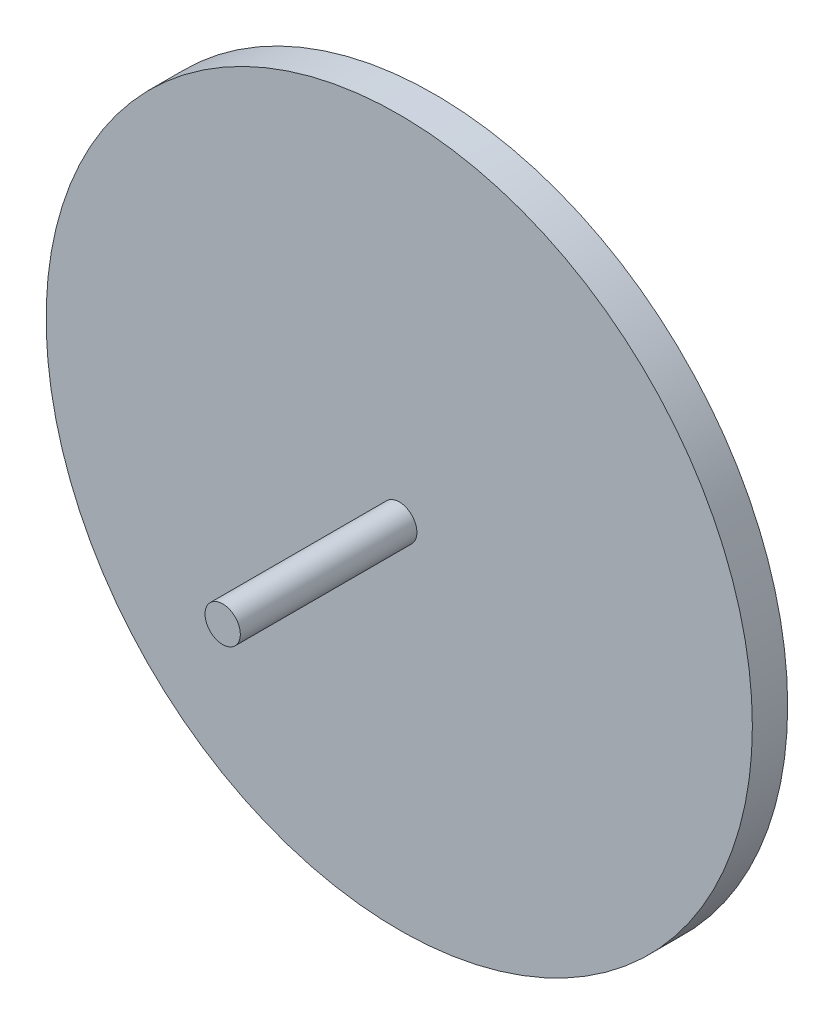
ISO-10303-21;
HEADER;
FILE_DESCRIPTION(('STEP AP214'),'2;1');
FILE_NAME('part.step','',(''),(''),'','','');
FILE_SCHEMA(('AUTOMOTIVE_DESIGN { 1 0 10303 214 1 1 1 1 }'));
ENDSEC;
DATA;
#1=APPLICATION_CONTEXT('core data for automotive mechanical design processes');
#2=APPLICATION_PROTOCOL_DEFINITION('international standard','automotive_design',2000,#1);
#3=PRODUCT_CONTEXT('',#1,'mechanical');
#4=PRODUCT('Part','Part','',(#3));
#5=PRODUCT_RELATED_PRODUCT_CATEGORY('part','',(#4));
#6=PRODUCT_DEFINITION_FORMATION('','',#4);
#7=PRODUCT_DEFINITION_CONTEXT('part definition',#1,'design');
#8=PRODUCT_DEFINITION('design','',#6,#7);
#9=PRODUCT_DEFINITION_SHAPE('','',#8);
#10=(LENGTH_UNIT() NAMED_UNIT(*) SI_UNIT(.MILLI.,.METRE.));
#11=(NAMED_UNIT(*) PLANE_ANGLE_UNIT() SI_UNIT($,.RADIAN.));
#12=(NAMED_UNIT(*) SI_UNIT($,.STERADIAN.) SOLID_ANGLE_UNIT());
#13=UNCERTAINTY_MEASURE_WITH_UNIT(LENGTH_MEASURE(1.E-05),#10,'distance_accuracy_value','');
#14=(GEOMETRIC_REPRESENTATION_CONTEXT(3) GLOBAL_UNCERTAINTY_ASSIGNED_CONTEXT((#13)) GLOBAL_UNIT_ASSIGNED_CONTEXT((#10,
#11,#12)) REPRESENTATION_CONTEXT('',''));
#15=CARTESIAN_POINT('',(0.,0.,0.));
#16=DIRECTION('',(0.,0.,1.));
#17=DIRECTION('',(1.,0.,0.));
#18=AXIS2_PLACEMENT_3D('',#15,#16,#17);
#19=CARTESIAN_POINT('',(0.,0.,5.));
#20=DIRECTION('',(0.,0.,1.));
#21=DIRECTION('',(1.,0.,0.));
#22=AXIS2_PLACEMENT_3D('',#19,#20,#21);
#23=PLANE('',#22);
#24=CARTESIAN_POINT('',(0.,0.,5.));
#25=DIRECTION('',(0.,0.,1.));
#26=DIRECTION('',(1.,0.,0.));
#27=AXIS2_PLACEMENT_3D('',#24,#25,#26);
#28=CIRCLE('',#27,50.);
#29=CARTESIAN_POINT('',(50.,0.,5.));
#30=VERTEX_POINT('',#29);
#31=EDGE_CURVE('E10',#30,#30,#28,.T.);
#32=ORIENTED_EDGE('',*,*,#31,.T.);
#33=EDGE_LOOP('',(#32));
#34=FACE_BOUND('',#33,.T.);
#35=CARTESIAN_POINT('',(0.,0.,5.));
#36=DIRECTION('',(0.,0.,1.));
#37=DIRECTION('',(1.,0.,0.));
#38=AXIS2_PLACEMENT_3D('',#35,#36,#37);
#39=CIRCLE('',#38,2.5);
#40=CARTESIAN_POINT('',(2.5,0.,5.));
#41=VERTEX_POINT('',#40);
#42=EDGE_CURVE('E44',#41,#41,#39,.T.);
#43=ORIENTED_EDGE('',*,*,#42,.F.);
#44=EDGE_LOOP('',(#43));
#45=FACE_BOUND('',#44,.T.);
#46=ADVANCED_FACE('F31',(#34,#45),#23,.T.);
#47=CARTESIAN_POINT('',(0.,0.,5.));
#48=DIRECTION('',(0.,0.,-1.));
#49=DIRECTION('',(-1.,0.,0.));
#50=AXIS2_PLACEMENT_3D('',#47,#48,#49);
#51=CYLINDRICAL_SURFACE('',#50,50.);
#52=ORIENTED_EDGE('',*,*,#31,.F.);
#53=EDGE_LOOP('',(#52));
#54=FACE_BOUND('',#53,.T.);
#55=CARTESIAN_POINT('',(0.,0.,0.));
#56=DIRECTION('',(0.,0.,1.));
#57=DIRECTION('',(1.,0.,0.));
#58=AXIS2_PLACEMENT_3D('',#55,#56,#57);
#59=CIRCLE('',#58,50.);
#60=CARTESIAN_POINT('',(50.,0.,0.));
#61=VERTEX_POINT('',#60);
#62=EDGE_CURVE('E35',#61,#61,#59,.T.);
#63=ORIENTED_EDGE('',*,*,#62,.T.);
#64=EDGE_LOOP('',(#63));
#65=FACE_BOUND('',#64,.T.);
#66=ADVANCED_FACE('F33',(#54,#65),#51,.T.);
#67=CARTESIAN_POINT('',(0.,0.,0.));
#68=DIRECTION('',(0.,0.,1.));
#69=DIRECTION('',(1.,0.,0.));
#70=AXIS2_PLACEMENT_3D('',#67,#68,#69);
#71=PLANE('',#70);
#72=ORIENTED_EDGE('',*,*,#62,.F.);
#73=EDGE_LOOP('',(#72));
#74=FACE_BOUND('',#73,.T.);
#75=ADVANCED_FACE('F55',(#74),#71,.F.);
#76=CARTESIAN_POINT('',(0.,0.,30.));
#77=DIRECTION('',(0.,0.,-1.));
#78=DIRECTION('',(-1.,0.,0.));
#79=AXIS2_PLACEMENT_3D('',#76,#77,#78);
#80=CYLINDRICAL_SURFACE('',#79,2.5);
#81=CARTESIAN_POINT('',(0.,0.,30.));
#82=DIRECTION('',(0.,0.,1.));
#83=DIRECTION('',(1.,0.,0.));
#84=AXIS2_PLACEMENT_3D('',#81,#82,#83);
#85=CIRCLE('',#84,2.5);
#86=CARTESIAN_POINT('',(2.5,0.,30.));
#87=VERTEX_POINT('',#86);
#88=EDGE_CURVE('E42',#87,#87,#85,.T.);
#89=ORIENTED_EDGE('',*,*,#88,.F.);
#90=EDGE_LOOP('',(#89));
#91=FACE_BOUND('',#90,.T.);
#92=ORIENTED_EDGE('',*,*,#42,.T.);
#93=EDGE_LOOP('',(#92));
#94=FACE_BOUND('',#93,.T.);
#95=ADVANCED_FACE('F52',(#91,#94),#80,.T.);
#96=CARTESIAN_POINT('',(0.,0.,30.));
#97=DIRECTION('',(0.,0.,1.));
#98=DIRECTION('',(1.,0.,0.));
#99=AXIS2_PLACEMENT_3D('',#96,#97,#98);
#100=PLANE('',#99);
#101=ORIENTED_EDGE('',*,*,#88,.T.);
#102=EDGE_LOOP('',(#101));
#103=FACE_BOUND('',#102,.T.);
#104=ADVANCED_FACE('F50',(#103),#100,.T.);
#105=CLOSED_SHELL('',(#46,#66,#75,#95,#104));
#106=MANIFOLD_SOLID_BREP('B2',#105);
#107=ADVANCED_BREP_SHAPE_REPRESENTATION('',(#18,#106),#14);
#108=SHAPE_DEFINITION_REPRESENTATION(#9,#107);
ENDSEC;
END-ISO-10303-21;
